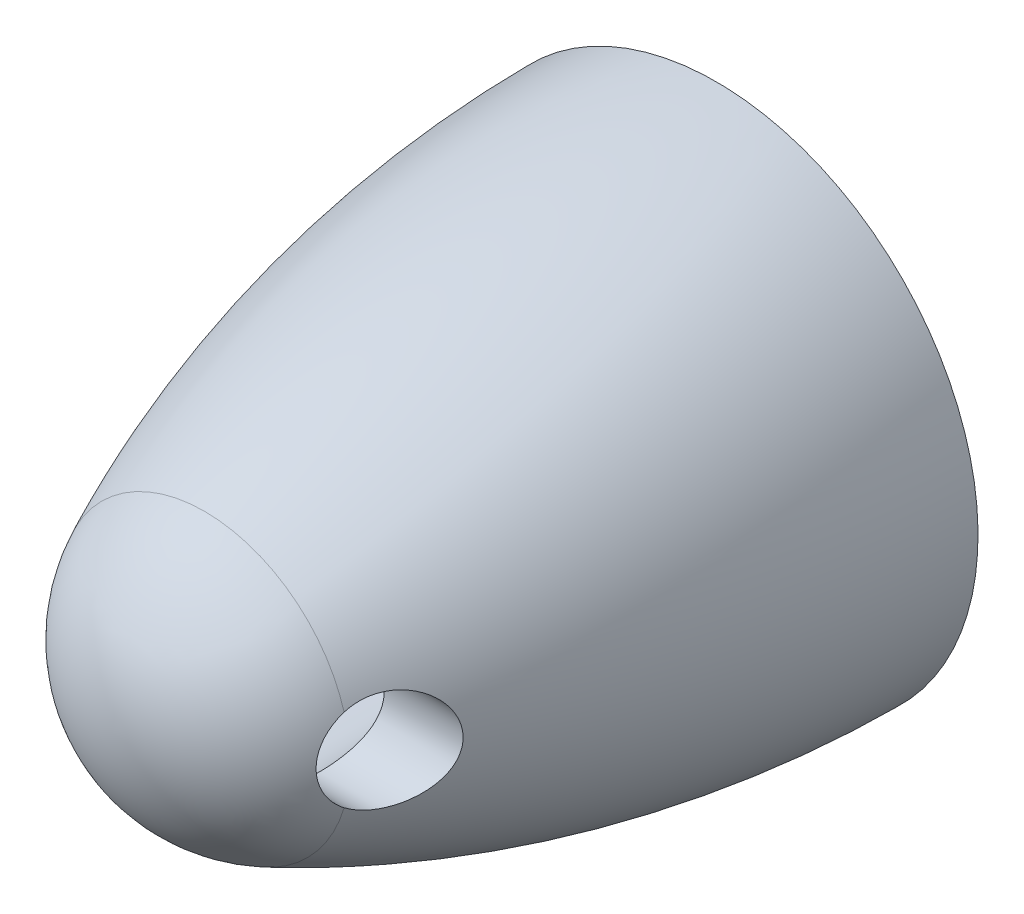
ISO-10303-21;
HEADER;
FILE_DESCRIPTION(('STEP AP214'),'2;1');
FILE_NAME('part.step','',(''),(''),'','','');
FILE_SCHEMA(('AUTOMOTIVE_DESIGN { 1 0 10303 214 1 1 1 1 }'));
ENDSEC;
DATA;
#1=APPLICATION_CONTEXT('core data for automotive mechanical design processes');
#2=APPLICATION_PROTOCOL_DEFINITION('international standard','automotive_design',2000,#1);
#3=PRODUCT_CONTEXT('',#1,'mechanical');
#4=PRODUCT('Part','Part','',(#3));
#5=PRODUCT_RELATED_PRODUCT_CATEGORY('part','',(#4));
#6=PRODUCT_DEFINITION_FORMATION('','',#4);
#7=PRODUCT_DEFINITION_CONTEXT('part definition',#1,'design');
#8=PRODUCT_DEFINITION('design','',#6,#7);
#9=PRODUCT_DEFINITION_SHAPE('','',#8);
#10=(LENGTH_UNIT() NAMED_UNIT(*) SI_UNIT(.MILLI.,.METRE.));
#11=(NAMED_UNIT(*) PLANE_ANGLE_UNIT() SI_UNIT($,.RADIAN.));
#12=(NAMED_UNIT(*) SI_UNIT($,.STERADIAN.) SOLID_ANGLE_UNIT());
#13=UNCERTAINTY_MEASURE_WITH_UNIT(LENGTH_MEASURE(1.E-05),#10,'distance_accuracy_value','');
#14=(GEOMETRIC_REPRESENTATION_CONTEXT(3) GLOBAL_UNCERTAINTY_ASSIGNED_CONTEXT((#13)) GLOBAL_UNIT_ASSIGNED_CONTEXT((#10,
#11,#12)) REPRESENTATION_CONTEXT('',''));
#15=CARTESIAN_POINT('',(0.,0.,0.));
#16=DIRECTION('',(0.,0.,1.));
#17=DIRECTION('',(1.,0.,0.));
#18=AXIS2_PLACEMENT_3D('',#15,#16,#17);
#19=CARTESIAN_POINT('',(0.,0.,-0.124297730643496));
#20=DIRECTION('',(0.,0.,-1.));
#21=DIRECTION('',(-1.,0.,0.));
#22=AXIS2_PLACEMENT_3D('',#19,#20,#21);
#23=DEGENERATE_TOROIDAL_SURFACE('',#22,23.5,30.,.F.);
#24=CARTESIAN_POINT('',(3.46615625761982,-1.02765857423062,12.711630420099));
#25=CARTESIAN_POINT('',(3.47465651878689,-1.04807601790001,12.6821488078625));
#26=CARTESIAN_POINT('',(3.48374766010701,-1.06712862057592,12.6519200785689));
#27=CARTESIAN_POINT('',(3.50309052405663,-1.10243743812266,12.5902486369812));
#28=CARTESIAN_POINT('',(3.51334161047095,-1.11869517373248,12.5588065963497));
#29=CARTESIAN_POINT('',(3.54569363617164,-1.16303698172731,12.4633973358953));
#30=CARTESIAN_POINT('',(3.56949134532311,-1.18692508612594,12.3980025103404));
#31=CARTESIAN_POINT('',(3.62091844613364,-1.22333503982868,12.2658092840912));
#32=CARTESIAN_POINT('',(3.64854074952291,-1.23587759957957,12.1990136695126));
#33=CARTESIAN_POINT('',(3.70681105154354,-1.2500872990971,12.0655208834277));
#34=CARTESIAN_POINT('',(3.73746269455597,-1.2517411737642,11.9988239309236));
#35=CARTESIAN_POINT('',(3.80351490544663,-1.24434703905072,11.861259635281));
#36=CARTESIAN_POINT('',(3.83909689606422,-1.23436062493811,11.7905308092886));
#37=CARTESIAN_POINT('',(3.9113272630148,-1.20275326419728,11.6522655507179));
#38=CARTESIAN_POINT('',(3.94797629708653,-1.1811249913421,11.5847311575426));
#39=CARTESIAN_POINT('',(4.02469297780867,-1.12397496211952,11.4475056703041));
#40=CARTESIAN_POINT('',(4.06473135870797,-1.08726895060851,11.3782876521898));
#41=CARTESIAN_POINT('',(4.14255243030917,-1.00086921026723,11.2470563802899));
#42=CARTESIAN_POINT('',(4.18033646123778,-0.951183294521051,11.185038824608));
#43=CARTESIAN_POINT('',(4.24541493725388,-0.849001575646202,11.0801635999997));
#44=CARTESIAN_POINT('',(4.2733974843864,-0.798445406406109,11.0358437013666));
#45=CARTESIAN_POINT('',(4.3249783972579,-0.689377513593669,10.9550811469388));
#46=CARTESIAN_POINT('',(4.34857873682077,-0.630869392389148,10.9186349434773));
#47=CARTESIAN_POINT('',(4.39008150812592,-0.506448993258439,10.8550436216105));
#48=CARTESIAN_POINT('',(4.40793765899972,-0.440482093425154,10.8279739220414));
#49=CARTESIAN_POINT('',(4.43622417721521,-0.303444308141968,10.785276500215));
#50=CARTESIAN_POINT('',(4.44666273854468,-0.232379150464057,10.7696361517536));
#51=CARTESIAN_POINT('',(4.45826446233044,-0.0979961087418942,10.7522692358374));
#52=CARTESIAN_POINT('',(4.46051811805218,-0.034979879450924,10.7489064930713));
#53=CARTESIAN_POINT('',(4.45863837968193,0.0907322715302227,10.7517152493736));
#54=CARTESIAN_POINT('',(4.45450726011885,0.153428299307684,10.7578833531483));
#55=CARTESIAN_POINT('',(4.44066289902417,0.272361000949817,10.7786394180797));
#56=CARTESIAN_POINT('',(4.43134131323984,0.328749289766289,10.7926369029275));
#57=CARTESIAN_POINT('',(4.40799520467772,0.438161470441607,10.8278993157812));
#58=CARTESIAN_POINT('',(4.39396992501944,0.491184819207408,10.849165413404));
#59=CARTESIAN_POINT('',(4.36090123082357,0.596210336186879,10.8997047325471));
#60=CARTESIAN_POINT('',(4.3415891222775,0.647917687200737,10.9294114762099));
#61=CARTESIAN_POINT('',(4.29940749033492,0.745627075753359,10.9950083643971));
#62=CARTESIAN_POINT('',(4.27653625785515,0.791626353113697,11.0309014804989));
#63=CARTESIAN_POINT('',(4.22458265077447,0.883776734141518,11.1135403400333));
#64=CARTESIAN_POINT('',(4.19508148119489,0.928955677666932,11.1611058160657));
#65=CARTESIAN_POINT('',(4.13383378409108,1.01081247199557,11.2617767082244));
#66=CARTESIAN_POINT('',(4.10208589385355,1.04748510474333,11.3148854959955));
#67=CARTESIAN_POINT('',(4.03247294041364,1.11701881046211,11.434107009109));
#68=CARTESIAN_POINT('',(3.99441880900892,1.1484229957194,11.5009627730063));
#69=CARTESIAN_POINT('',(3.91835692344024,1.19906331819373,11.6392070048179));
#70=CARTESIAN_POINT('',(3.88034922027089,1.21829093660621,11.7105986076977));
#71=CARTESIAN_POINT('',(3.80327227845025,1.2448409938488,11.8616070159147));
#72=CARTESIAN_POINT('',(3.76431611160357,1.25123195075573,11.9414492883429));
#73=CARTESIAN_POINT('',(3.69002998848706,1.24838053525451,12.1025670852601));
#74=CARTESIAN_POINT('',(3.65469779248747,1.23914788124002,12.1838416876773));
#75=CARTESIAN_POINT('',(3.5953476307428,1.207483336925,12.3301828209219));
#76=CARTESIAN_POINT('',(3.57044323891807,1.18778459777512,12.3954866641329));
#77=CARTESIAN_POINT('',(3.52491624039993,1.13732912918625,12.5231244075804));
#78=CARTESIAN_POINT('',(3.5042820068257,1.10660306680085,12.5854660066867));
#79=CARTESIAN_POINT('',(3.47900904484297,1.05702781846493,12.6677528802878));
#80=CARTESIAN_POINT('',(3.47241621892549,1.04271142203358,12.6899059204764));
#81=CARTESIAN_POINT('',(3.46615625761982,1.02765857423064,12.711630420099));
#82=B_SPLINE_CURVE_WITH_KNOTS('',3,(#24,#25,#26,#27,#28,#29,#30,#31,#32,#33,#34,#35,#36,#37,#38,
#39,#40,#41,#42,#43,#44,#45,#46,#47,#48,#49,#50,#51,#52,#53,#54,#55,#56,#57,#58,#59,#60,#61,#62,
#63,#64,#65,#66,#67,#68,#69,#70,#71,#72,#73,#74,#75,#76,#77,#78,#79,#80,#81),.UNSPECIFIED.,.F.,
.F.,(4,2,2,2,2,2,2,2,2,2,2,2,2,2,2,2,2,2,2,2,2,2,2,2,2,2,2,2,4),(0.,0.110486533528863,
0.220912757686076,0.440497174869241,0.659679943384847,0.879129681151121,1.11756815341486,
1.35615685084225,1.61888418770536,1.88145374221404,2.09904073576579,2.31652948528037,
2.53572903280445,2.75468605916668,2.94310848524276,3.13146380269543,3.30722666936411,
3.48301783195744,3.67033316264982,3.85773872089173,4.07269962562468,4.28779204787302,
4.53601125669036,4.78440392997816,5.05025050034675,5.31593176628929,5.5328572035393,
5.74918398596229,5.83068670753945),.UNSPECIFIED.);
#83=CARTESIAN_POINT('',(3.46621395182149,-1.02779704093647,12.711430420099));
#84=VERTEX_POINT('',#83);
#85=CARTESIAN_POINT('',(3.4662139518215,1.02779704093647,12.711430420099));
#86=VERTEX_POINT('',#85);
#87=EDGE_CURVE('E60',#84,#86,#82,.T.);
#88=ORIENTED_EDGE('',*,*,#87,.F.);
#89=CARTESIAN_POINT('',(0.,0.,12.711430420099));
#90=DIRECTION('',(0.,0.,-1.));
#91=DIRECTION('',(-1.,0.,0.));
#92=AXIS2_PLACEMENT_3D('',#89,#90,#91);
#93=CIRCLE('',#92,3.61538461538462);
#94=CARTESIAN_POINT('',(-3.4662139518215,-1.02779704093647,12.711430420099));
#95=VERTEX_POINT('',#94);
#96=EDGE_CURVE('E109',#84,#95,#93,.T.);
#97=ORIENTED_EDGE('',*,*,#96,.T.);
#98=CARTESIAN_POINT('',(-3.46615625761982,1.02765857423062,12.711630420099));
#99=CARTESIAN_POINT('',(-3.47465651878689,1.04807601790001,12.6821488078625));
#100=CARTESIAN_POINT('',(-3.48374766010701,1.06712862057592,12.6519200785689));
#101=CARTESIAN_POINT('',(-3.50309052405663,1.10243743812266,12.5902486369812));
#102=CARTESIAN_POINT('',(-3.51334161047095,1.11869517373248,12.5588065963497));
#103=CARTESIAN_POINT('',(-3.54569363617164,1.16303698172731,12.4633973358953));
#104=CARTESIAN_POINT('',(-3.56949134532311,1.18692508612594,12.3980025103404));
#105=CARTESIAN_POINT('',(-3.62091844613364,1.22333503982868,12.2658092840912));
#106=CARTESIAN_POINT('',(-3.64854074952291,1.23587759957957,12.1990136695126));
#107=CARTESIAN_POINT('',(-3.70681105154354,1.2500872990971,12.0655208834277));
#108=CARTESIAN_POINT('',(-3.73746269455597,1.2517411737642,11.9988239309236));
#109=CARTESIAN_POINT('',(-3.80351490544663,1.24434703905072,11.861259635281));
#110=CARTESIAN_POINT('',(-3.83909689606422,1.23436062493811,11.7905308092886));
#111=CARTESIAN_POINT('',(-3.9113272630148,1.20275326419728,11.6522655507179));
#112=CARTESIAN_POINT('',(-3.94797629708653,1.1811249913421,11.5847311575426));
#113=CARTESIAN_POINT('',(-4.02469297780867,1.12397496211952,11.4475056703041));
#114=CARTESIAN_POINT('',(-4.06473135870797,1.08726895060851,11.3782876521898));
#115=CARTESIAN_POINT('',(-4.14255243030917,1.00086921026723,11.2470563802899));
#116=CARTESIAN_POINT('',(-4.18033646123778,0.951183294521051,11.185038824608));
#117=CARTESIAN_POINT('',(-4.24541493725388,0.849001575646202,11.0801635999997));
#118=CARTESIAN_POINT('',(-4.2733974843864,0.798445406406109,11.0358437013666));
#119=CARTESIAN_POINT('',(-4.3249783972579,0.689377513593669,10.9550811469388));
#120=CARTESIAN_POINT('',(-4.34857873682077,0.630869392389148,10.9186349434773));
#121=CARTESIAN_POINT('',(-4.39008150812592,0.506448993258439,10.8550436216105));
#122=CARTESIAN_POINT('',(-4.40793765899972,0.440482093425154,10.8279739220414));
#123=CARTESIAN_POINT('',(-4.43622417721521,0.303444308141968,10.785276500215));
#124=CARTESIAN_POINT('',(-4.44666273854468,0.232379150464057,10.7696361517536));
#125=CARTESIAN_POINT('',(-4.45826446233044,0.0979961087418942,10.7522692358374));
#126=CARTESIAN_POINT('',(-4.46051811805218,0.034979879450924,10.7489064930713));
#127=CARTESIAN_POINT('',(-4.45863837968193,-0.0907322715302227,10.7517152493736));
#128=CARTESIAN_POINT('',(-4.45450726011885,-0.153428299307684,10.7578833531483));
#129=CARTESIAN_POINT('',(-4.44066289902417,-0.272361000949817,10.7786394180797));
#130=CARTESIAN_POINT('',(-4.43134131323984,-0.328749289766289,10.7926369029275));
#131=CARTESIAN_POINT('',(-4.40799520467772,-0.438161470441607,10.8278993157812));
#132=CARTESIAN_POINT('',(-4.39396992501944,-0.491184819207408,10.849165413404));
#133=CARTESIAN_POINT('',(-4.36090123082357,-0.596210336186879,10.8997047325471));
#134=CARTESIAN_POINT('',(-4.3415891222775,-0.647917687200737,10.9294114762099));
#135=CARTESIAN_POINT('',(-4.29940749033492,-0.745627075753359,10.9950083643971));
#136=CARTESIAN_POINT('',(-4.27653625785515,-0.791626353113697,11.0309014804989));
#137=CARTESIAN_POINT('',(-4.22458265077447,-0.883776734141518,11.1135403400333));
#138=CARTESIAN_POINT('',(-4.19508148119489,-0.928955677666932,11.1611058160657));
#139=CARTESIAN_POINT('',(-4.13383378409108,-1.01081247199557,11.2617767082244));
#140=CARTESIAN_POINT('',(-4.10208589385355,-1.04748510474333,11.3148854959955));
#141=CARTESIAN_POINT('',(-4.03247294041364,-1.11701881046211,11.434107009109));
#142=CARTESIAN_POINT('',(-3.99441880900892,-1.1484229957194,11.5009627730063));
#143=CARTESIAN_POINT('',(-3.91835692344024,-1.19906331819373,11.6392070048179));
#144=CARTESIAN_POINT('',(-3.88034922027089,-1.21829093660621,11.7105986076977));
#145=CARTESIAN_POINT('',(-3.80327227845025,-1.2448409938488,11.8616070159147));
#146=CARTESIAN_POINT('',(-3.76431611160357,-1.25123195075573,11.9414492883429));
#147=CARTESIAN_POINT('',(-3.69002998848706,-1.24838053525451,12.1025670852601));
#148=CARTESIAN_POINT('',(-3.65469779248747,-1.23914788124002,12.1838416876773));
#149=CARTESIAN_POINT('',(-3.5953476307428,-1.207483336925,12.3301828209219));
#150=CARTESIAN_POINT('',(-3.57044323891807,-1.18778459777512,12.3954866641329));
#151=CARTESIAN_POINT('',(-3.52491624039993,-1.13732912918625,12.5231244075804));
#152=CARTESIAN_POINT('',(-3.5042820068257,-1.10660306680085,12.5854660066867));
#153=CARTESIAN_POINT('',(-3.47900904484297,-1.05702781846493,12.6677528802878));
#154=CARTESIAN_POINT('',(-3.47241621892549,-1.04271142203358,12.6899059204764));
#155=CARTESIAN_POINT('',(-3.46615625761982,-1.02765857423064,12.711630420099));
#156=B_SPLINE_CURVE_WITH_KNOTS('',3,(#98,#99,#100,#101,#102,#103,#104,#105,#106,#107,#108,#109,
#110,#111,#112,#113,#114,#115,#116,#117,#118,#119,#120,#121,#122,#123,#124,#125,#126,#127,#128,
#129,#130,#131,#132,#133,#134,#135,#136,#137,#138,#139,#140,#141,#142,#143,#144,#145,#146,#147,
#148,#149,#150,#151,#152,#153,#154,#155),.UNSPECIFIED.,.F.,.F.,(4,2,2,2,2,2,2,2,2,2,2,2,2,2,2,2,
2,2,2,2,2,2,2,2,2,2,2,2,4),(0.,0.110486533528863,0.220912757686076,0.440497174869241,
0.659679943384847,0.879129681151121,1.11756815341486,1.35615685084225,1.61888418770536,
1.88145374221404,2.09904073576579,2.31652948528037,2.53572903280445,2.75468605916668,
2.94310848524276,3.13146380269543,3.30722666936411,3.48301783195744,3.67033316264982,
3.85773872089173,4.07269962562468,4.28779204787302,4.53601125669036,4.78440392997816,
5.05025050034675,5.31593176628929,5.5328572035393,5.74918398596229,5.83068670753945),.UNSPECIFIED.);
#157=CARTESIAN_POINT('',(-3.46621395182149,1.02779704093647,12.711430420099));
#158=VERTEX_POINT('',#157);
#159=EDGE_CURVE('E53',#158,#95,#156,.T.);
#160=ORIENTED_EDGE('',*,*,#159,.F.);
#161=EDGE_CURVE('E89',#158,#86,#93,.T.);
#162=ORIENTED_EDGE('',*,*,#161,.T.);
#163=EDGE_LOOP('',(#88,#97,#160,#162));
#164=FACE_BOUND('',#163,.T.);
#165=CARTESIAN_POINT('',(0.,0.,0.));
#166=DIRECTION('',(0.,0.,-1.));
#167=DIRECTION('',(-1.,0.,0.));
#168=AXIS2_PLACEMENT_3D('',#165,#166,#167);
#169=CIRCLE('',#168,6.49974250013085);
#170=CARTESIAN_POINT('',(-6.49974250013085,0.,0.));
#171=VERTEX_POINT('',#170);
#172=EDGE_CURVE('E102',#171,#171,#169,.T.);
#173=ORIENTED_EDGE('',*,*,#172,.F.);
#174=EDGE_LOOP('',(#173));
#175=FACE_BOUND('',#174,.T.);
#176=ADVANCED_FACE('F34',(#164,#175),#23,.F.);
#177=CARTESIAN_POINT('',(0.,0.,11.));
#178=DIRECTION('',(0.,0.,-1.));
#179=DIRECTION('',(0.,1.,0.));
#180=AXIS2_PLACEMENT_3D('',#177,#178,#179);
#181=SPHERICAL_SURFACE('',#180,4.);
#182=CARTESIAN_POINT('',(3.46627165118402,1.02793545007738,12.711230420099));
#183=CARTESIAN_POINT('',(3.45803902218797,1.00818969012669,12.7397674543915));
#184=CARTESIAN_POINT('',(3.45000627031838,0.987237789776852,12.7675088994648));
#185=CARTESIAN_POINT('',(3.43439958141427,0.94302341904918,12.8212301181988));
#186=CARTESIAN_POINT('',(3.42682571528331,0.919760593062849,12.8472096196909));
#187=CARTESIAN_POINT('',(3.40488372223414,0.84666448856219,12.9222401803932));
#188=CARTESIAN_POINT('',(3.39129642293037,0.793526503439699,12.9683790690547));
#189=CARTESIAN_POINT('',(3.36674042592054,0.679793768546704,13.0513554191213));
#190=CARTESIAN_POINT('',(3.35577557736714,0.61918825332215,13.0881792126297));
#191=CARTESIAN_POINT('',(3.33695310855825,0.492266162903189,13.151166471323));
#192=CARTESIAN_POINT('',(3.32909284973387,0.4259544959628,13.1773389895286));
#193=CARTESIAN_POINT('',(3.31701014120736,0.291540725185956,13.2174897710237));
#194=CARTESIAN_POINT('',(3.31268850861892,0.223546838764541,13.2318006528038));
#195=CARTESIAN_POINT('',(3.3075034118584,0.0859791264112251,13.2489640834034));
#196=CARTESIAN_POINT('',(3.30664048027637,0.0164050588128973,13.2518148675334));
#197=CARTESIAN_POINT('',(3.30839142175228,-0.120363810146961,13.2460233692186));
#198=CARTESIAN_POINT('',(3.31091387649477,-0.187572845927709,13.2376832841001));
#199=CARTESIAN_POINT('',(3.3191621851794,-0.31956037109663,13.2103395713086));
#200=CARTESIAN_POINT('',(3.32488723856617,-0.384339463582685,13.1913386085377));
#201=CARTESIAN_POINT('',(3.33931426353958,-0.509876099118331,13.1432659757738));
#202=CARTESIAN_POINT('',(3.34802396904084,-0.570622699970703,13.1141681399869));
#203=CARTESIAN_POINT('',(3.36807377260888,-0.686375856511214,13.0468396411053));
#204=CARTESIAN_POINT('',(3.37941492014439,-0.741380109318647,13.0086053340311));
#205=CARTESIAN_POINT('',(3.40277421136701,-0.837957448710605,12.9293729587975));
#206=CARTESIAN_POINT('',(3.4145380668557,-0.88035042416542,12.88929130541));
#207=CARTESIAN_POINT('',(3.43944415766713,-0.958933579989559,12.8039406092823));
#208=CARTESIAN_POINT('',(3.45258428920337,-0.995133011057766,12.7586794744089));
#209=CARTESIAN_POINT('',(3.46627165118402,-1.02793545007738,12.711230420099));
#210=B_SPLINE_CURVE_WITH_KNOTS('',3,(#182,#183,#184,#185,#186,#187,#188,#189,#190,#191,#192,
#193,#194,#195,#196,#197,#198,#199,#200,#201,#202,#203,#204,#205,#206,#207,#208,#209),
.UNSPECIFIED.,.F.,.F.,(4,2,2,2,2,2,2,2,2,2,2,2,2,4),(0.,0.106935836816099,0.213888154635262,
0.427808437343622,0.642040804790455,0.856090703844912,1.06391317855968,1.27176765370786,
1.47412071043617,1.67642320744738,1.87925393074501,2.08216568623032,2.26015223816337,
2.4378705830193),.UNSPECIFIED.);
#211=EDGE_CURVE('E143',#86,#84,#210,.T.);
#212=ORIENTED_EDGE('',*,*,#211,.F.);
#213=ORIENTED_EDGE('',*,*,#161,.F.);
#214=CARTESIAN_POINT('',(-3.46627165118402,-1.02793545007738,12.711230420099));
#215=CARTESIAN_POINT('',(-3.45803902218797,-1.00818969012669,12.7397674543915));
#216=CARTESIAN_POINT('',(-3.45000627031839,-0.987237789776852,12.7675088994648));
#217=CARTESIAN_POINT('',(-3.43439958141427,-0.94302341904918,12.8212301181988));
#218=CARTESIAN_POINT('',(-3.42682571528331,-0.919760593062849,12.8472096196909));
#219=CARTESIAN_POINT('',(-3.40488372223413,-0.846664488562191,12.9222401803932));
#220=CARTESIAN_POINT('',(-3.39129642293037,-0.793526503439699,12.9683790690547));
#221=CARTESIAN_POINT('',(-3.36674042592054,-0.679793768546704,13.0513554191213));
#222=CARTESIAN_POINT('',(-3.35577557736714,-0.61918825332215,13.0881792126297));
#223=CARTESIAN_POINT('',(-3.33695310855826,-0.492266162903189,13.151166471323));
#224=CARTESIAN_POINT('',(-3.32909284973387,-0.425954495962799,13.1773389895286));
#225=CARTESIAN_POINT('',(-3.31701014120736,-0.291540725185956,13.2174897710237));
#226=CARTESIAN_POINT('',(-3.31268850861892,-0.223546838764541,13.2318006528038));
#227=CARTESIAN_POINT('',(-3.3075034118584,-0.085979126411225,13.2489640834034));
#228=CARTESIAN_POINT('',(-3.30664048027637,-0.016405058812897,13.2518148675334));
#229=CARTESIAN_POINT('',(-3.30839142175228,0.120363810146962,13.2460233692186));
#230=CARTESIAN_POINT('',(-3.31091387649477,0.18757284592771,13.2376832841001));
#231=CARTESIAN_POINT('',(-3.3191621851794,0.31956037109663,13.2103395713086));
#232=CARTESIAN_POINT('',(-3.32488723856617,0.384339463582685,13.1913386085377));
#233=CARTESIAN_POINT('',(-3.33931426353958,0.509876099118331,13.1432659757738));
#234=CARTESIAN_POINT('',(-3.34802396904084,0.570622699970703,13.1141681399869));
#235=CARTESIAN_POINT('',(-3.36807377260888,0.686375856511215,13.0468396411053));
#236=CARTESIAN_POINT('',(-3.37941492014439,0.741380109318647,13.0086053340311));
#237=CARTESIAN_POINT('',(-3.40277421136701,0.837957448710606,12.9293729587975));
#238=CARTESIAN_POINT('',(-3.4145380668557,0.880350424165421,12.88929130541));
#239=CARTESIAN_POINT('',(-3.43944415766713,0.95893357998956,12.8039406092823));
#240=CARTESIAN_POINT('',(-3.45258428920337,0.995133011057767,12.7586794744089));
#241=CARTESIAN_POINT('',(-3.46627165118402,1.02793545007738,12.711230420099));
#242=B_SPLINE_CURVE_WITH_KNOTS('',3,(#214,#215,#216,#217,#218,#219,#220,#221,#222,#223,#224,
#225,#226,#227,#228,#229,#230,#231,#232,#233,#234,#235,#236,#237,#238,#239,#240,#241),
.UNSPECIFIED.,.F.,.F.,(4,2,2,2,2,2,2,2,2,2,2,2,2,4),(0.,0.106935836816099,0.213888154635263,
0.427808437343622,0.642040804790455,0.856090703844912,1.06391317855968,1.27176765370786,
1.47412071043617,1.67642320744738,1.87925393074501,2.08216568623032,2.26015223816338,
2.43787058301929),.UNSPECIFIED.);
#243=EDGE_CURVE('E134',#95,#158,#242,.T.);
#244=ORIENTED_EDGE('',*,*,#243,.F.);
#245=ORIENTED_EDGE('',*,*,#96,.F.);
#246=EDGE_LOOP('',(#212,#213,#244,#245));
#247=FACE_BOUND('',#246,.T.);
#248=ADVANCED_FACE('F150',(#247),#181,.T.);
#249=CARTESIAN_POINT('',(0.,1.48879112486373,0.));
#250=DIRECTION('',(0.,0.,-1.));
#251=DIRECTION('',(-1.,0.,0.));
#252=AXIS2_PLACEMENT_3D('',#249,#250,#251);
#253=PLANE('',#252);
#254=CARTESIAN_POINT('',(0.,0.,0.));
#255=DIRECTION('',(0.,0.,-1.));
#256=DIRECTION('',(-1.,0.,0.));
#257=AXIS2_PLACEMENT_3D('',#254,#255,#256);
#258=CIRCLE('',#257,2.5);
#259=CARTESIAN_POINT('',(-2.5,0.,0.));
#260=VERTEX_POINT('',#259);
#261=EDGE_CURVE('E100',#260,#260,#258,.T.);
#262=ORIENTED_EDGE('',*,*,#261,.F.);
#263=EDGE_LOOP('',(#262));
#264=FACE_BOUND('',#263,.T.);
#265=ORIENTED_EDGE('',*,*,#172,.T.);
#266=EDGE_LOOP('',(#265));
#267=FACE_BOUND('',#266,.T.);
#268=ADVANCED_FACE('F154',(#264,#267),#253,.T.);
#269=CARTESIAN_POINT('',(0.,0.,12.99972));
#270=DIRECTION('',(0.,0.,-1.));
#271=DIRECTION('',(-1.,0.,0.));
#272=AXIS2_PLACEMENT_3D('',#269,#270,#271);
#273=CONICAL_SURFACE('',#272,2.5,1.02974425867665);
#274=CARTESIAN_POINT('',(0.,0.,14.5018715475689));
#275=VERTEX_POINT('',#274);
#276=VERTEX_LOOP('',#275);
#277=FACE_BOUND('',#276,.T.);
#278=CARTESIAN_POINT('',(0.,0.,12.99972));
#279=DIRECTION('',(0.,0.,-1.));
#280=DIRECTION('',(-1.,0.,0.));
#281=AXIS2_PLACEMENT_3D('',#278,#279,#280);
#282=CIRCLE('',#281,2.5);
#283=CARTESIAN_POINT('',(-2.38473060918838,0.750373188220366,12.99972));
#284=VERTEX_POINT('',#283);
#285=CARTESIAN_POINT('',(2.38473060918838,0.750373188220366,12.99972));
#286=VERTEX_POINT('',#285);
#287=EDGE_CURVE('E95',#284,#286,#282,.T.);
#288=ORIENTED_EDGE('',*,*,#287,.T.);
#289=CARTESIAN_POINT('',(2.41843538953355,0.782857165731378,12.9744919999995));
#290=CARTESIAN_POINT('',(2.38015192084589,0.747555570339361,13.0028570709257));
#291=CARTESIAN_POINT('',(2.34391136425703,0.709117786915568,13.0305663603079));
#292=CARTESIAN_POINT('',(2.27670366683037,0.625604102943495,13.0833205140522));
#293=CARTESIAN_POINT('',(2.24578659036323,0.580471906040079,13.108339331257));
#294=CARTESIAN_POINT('',(2.19093486669189,0.483450332028471,13.1539757337496));
#295=CARTESIAN_POINT('',(2.16705774268094,0.431510040259106,13.1745567102081));
#296=CARTESIAN_POINT('',(2.12797602481898,0.322607220560018,13.208992595813));
#297=CARTESIAN_POINT('',(2.11273447644694,0.265667315888708,13.2228761270467));
#298=CARTESIAN_POINT('',(2.09280599735473,0.156551449354937,13.241224424861));
#299=CARTESIAN_POINT('',(2.08698504606792,0.104748876163918,13.2466961817109));
#300=CARTESIAN_POINT('',(2.08230352072519,0.000494369861177152,13.2510876068438));
#301=CARTESIAN_POINT('',(2.08344895974321,-0.0519580852224945,13.2500016147795));
#302=CARTESIAN_POINT('',(2.09234839200907,-0.15178049140755,13.241685608966));
#303=CARTESIAN_POINT('',(2.09959933832403,-0.199236188901494,13.2349234006281));
#304=CARTESIAN_POINT('',(2.11990176757202,-0.29180933703555,13.216377130583));
#305=CARTESIAN_POINT('',(2.13294751744033,-0.336929049631821,13.2045980327872));
#306=CARTESIAN_POINT('',(2.16481408659789,-0.424740395339414,13.1765488957321));
#307=CARTESIAN_POINT('',(2.18375087863221,-0.467360768846897,13.1601893976775));
#308=CARTESIAN_POINT('',(2.22668325670814,-0.548502596668387,13.1241095402355));
#309=CARTESIAN_POINT('',(2.25068815386725,-0.587016307471462,13.1043830078928));
#310=CARTESIAN_POINT('',(2.29799109356211,-0.652821490846483,13.0665297686023));
#311=CARTESIAN_POINT('',(2.32057907161374,-0.680863648116198,13.0487956810759));
#312=CARTESIAN_POINT('',(2.36795409640419,-0.733994705629502,13.0123146764847));
#313=CARTESIAN_POINT('',(2.39272934348976,-0.759097934692559,12.9935733845859));
#314=CARTESIAN_POINT('',(2.41843538953355,-0.782857165731377,12.9744919999995));
#315=B_SPLINE_CURVE_WITH_KNOTS('',3,(#289,#290,#291,#292,#293,#294,#295,#296,#297,#298,#299,
#300,#301,#302,#303,#304,#305,#306,#307,#308,#309,#310,#311,#312,#313,#314),.UNSPECIFIED.,.F.,
.F.,(4,2,2,2,2,2,2,2,2,2,2,2,4),(0.,0.178142256052216,0.357877812589265,0.539043681841487,
0.719428309803198,0.875825551385949,1.03235780716231,1.17712792920599,1.32175514144313,
1.46943196376067,1.61738249617088,1.73761590187897,1.8572362711508),.UNSPECIFIED.);
#316=CARTESIAN_POINT('',(2.38473060918838,-0.750373188220366,12.99972));
#317=VERTEX_POINT('',#316);
#318=EDGE_CURVE('E84',#286,#317,#315,.T.);
#319=ORIENTED_EDGE('',*,*,#318,.T.);
#320=CARTESIAN_POINT('',(-2.38473060918838,-0.750373188220366,12.99972));
#321=VERTEX_POINT('',#320);
#322=EDGE_CURVE('E94',#317,#321,#282,.T.);
#323=ORIENTED_EDGE('',*,*,#322,.T.);
#324=CARTESIAN_POINT('',(-2.41843538953356,-0.782857165731383,12.9744919999995));
#325=CARTESIAN_POINT('',(-2.3801519208459,-0.747555570339366,13.0028570709257));
#326=CARTESIAN_POINT('',(-2.34391136425703,-0.709117786915574,13.0305663603079));
#327=CARTESIAN_POINT('',(-2.27670366683038,-0.625604102943501,13.0833205140522));
#328=CARTESIAN_POINT('',(-2.24578659036323,-0.580471906040084,13.108339331257));
#329=CARTESIAN_POINT('',(-2.19093486669189,-0.483450332028476,13.1539757337496));
#330=CARTESIAN_POINT('',(-2.16705774268095,-0.431510040259111,13.1745567102081));
#331=CARTESIAN_POINT('',(-2.12797602481898,-0.322607220560024,13.208992595813));
#332=CARTESIAN_POINT('',(-2.11273447644694,-0.265667315888713,13.2228761270467));
#333=CARTESIAN_POINT('',(-2.09280599735473,-0.156551449354942,13.241224424861));
#334=CARTESIAN_POINT('',(-2.08698504606792,-0.104748876163923,13.2466961817109));
#335=CARTESIAN_POINT('',(-2.08230352072519,-0.00049436986118134,13.2510876068438));
#336=CARTESIAN_POINT('',(-2.08344895974321,0.0519580852224906,13.2500016147795));
#337=CARTESIAN_POINT('',(-2.09234839200907,0.151780491407546,13.241685608966));
#338=CARTESIAN_POINT('',(-2.09959933832402,0.19923618890149,13.2349234006281));
#339=CARTESIAN_POINT('',(-2.11990176757202,0.291809337035547,13.216377130583));
#340=CARTESIAN_POINT('',(-2.13294751744033,0.336929049631817,13.2045980327872));
#341=CARTESIAN_POINT('',(-2.16481408659789,0.424740395339411,13.1765488957321));
#342=CARTESIAN_POINT('',(-2.18375087863221,0.467360768846894,13.1601893976775));
#343=CARTESIAN_POINT('',(-2.22668325670814,0.548502596668384,13.1241095402355));
#344=CARTESIAN_POINT('',(-2.25068815386724,0.587016307471459,13.1043830078928));
#345=CARTESIAN_POINT('',(-2.29799109356211,0.652821490846482,13.0665297686023));
#346=CARTESIAN_POINT('',(-2.32057907161374,0.680863648116198,13.0487956810759));
#347=CARTESIAN_POINT('',(-2.36795409640419,0.733994705629505,13.0123146764847));
#348=CARTESIAN_POINT('',(-2.39272934348977,0.759097934692564,12.9935733845859));
#349=CARTESIAN_POINT('',(-2.41843538953356,0.782857165731383,12.9744919999995));
#350=B_SPLINE_CURVE_WITH_KNOTS('',3,(#324,#325,#326,#327,#328,#329,#330,#331,#332,#333,#334,
#335,#336,#337,#338,#339,#340,#341,#342,#343,#344,#345,#346,#347,#348,#349),.UNSPECIFIED.,.F.,
.F.,(4,2,2,2,2,2,2,2,2,2,2,2,4),(0.,0.178142256052217,0.357877812589267,0.539043681841489,
0.719428309803201,0.875825551385953,1.03235780716232,1.17712792920599,1.32175514144313,
1.46943196376068,1.61738249617089,1.73761590187898,1.85723627115081),.UNSPECIFIED.);
#351=EDGE_CURVE('E96',#321,#284,#350,.T.);
#352=ORIENTED_EDGE('',*,*,#351,.T.);
#353=EDGE_LOOP('',(#288,#319,#323,#352));
#354=FACE_BOUND('',#353,.T.);
#355=ADVANCED_FACE('F92',(#277,#354),#273,.F.);
#356=CARTESIAN_POINT('',(0.,0.,0.));
#357=DIRECTION('',(0.,0.,-1.));
#358=DIRECTION('',(-1.,0.,0.));
#359=AXIS2_PLACEMENT_3D('',#356,#357,#358);
#360=CYLINDRICAL_SURFACE('',#359,2.5);
#361=ORIENTED_EDGE('',*,*,#287,.F.);
#362=CARTESIAN_POINT('',(-2.38473060918838,0.750373188220366,12.99972));
#363=CARTESIAN_POINT('',(-2.36671947980009,0.807707561243689,12.9566793971231));
#364=CARTESIAN_POINT('',(-2.34761211099683,0.86111153135778,12.908889740286));
#365=CARTESIAN_POINT('',(-2.3092508794602,0.959225480273842,12.8046951875723));
#366=CARTESIAN_POINT('',(-2.28999674652239,1.00389454166548,12.7482518553174));
#367=CARTESIAN_POINT('',(-2.25356885281377,1.08321151222637,12.6279706278234));
#368=CARTESIAN_POINT('',(-2.23639777697201,1.11784656631648,12.5641233923411));
#369=CARTESIAN_POINT('',(-2.20651439252,1.17573827559777,12.4305969901433));
#370=CARTESIAN_POINT('',(-2.19379240529353,1.19901967381694,12.3609308963749));
#371=CARTESIAN_POINT('',(-2.17544835561827,1.23197516578848,12.2224108264594));
#372=CARTESIAN_POINT('',(-2.16941656230033,1.24243922935435,12.1538014204813));
#373=CARTESIAN_POINT('',(-2.16402033572561,1.25181910642711,12.0155365886187));
#374=CARTESIAN_POINT('',(-2.16465291956715,1.25074008648746,11.9458816446449));
#375=CARTESIAN_POINT('',(-2.17202179220197,1.23788518801393,11.8157885301248));
#376=CARTESIAN_POINT('',(-2.17807230360743,1.22731078220807,11.7551859889477));
#377=CARTESIAN_POINT('',(-2.19454137439648,1.19761181947589,11.6367429817181));
#378=CARTESIAN_POINT('',(-2.20496109166308,1.17848499598458,11.5789032523675));
#379=CARTESIAN_POINT('',(-2.22949615272163,1.13140456317794,11.4648452938663));
#380=CARTESIAN_POINT('',(-2.24374791435555,1.10311503871926,11.4087962382031));
#381=CARTESIAN_POINT('',(-2.27424228235581,1.03879172433596,11.3019266688262));
#382=CARTESIAN_POINT('',(-2.29048590414888,1.00275397734808,11.2511088464182));
#383=CARTESIAN_POINT('',(-2.32560608340461,0.918631791662155,11.1494106106778));
#384=CARTESIAN_POINT('',(-2.34455576833182,0.869600122770776,11.0993355172204));
#385=CARTESIAN_POINT('',(-2.38119642034424,0.763576613982765,11.0078534126824));
#386=CARTESIAN_POINT('',(-2.39888692315868,0.706581860745757,10.9664495879527));
#387=CARTESIAN_POINT('',(-2.43170325730445,0.58392260602266,10.8923819054853));
#388=CARTESIAN_POINT('',(-2.44673440208834,0.518046685928492,10.8600231557655));
#389=CARTESIAN_POINT('',(-2.47180561188032,0.38082157996776,10.8071596931925));
#390=CARTESIAN_POINT('',(-2.48184998805827,0.309477183541861,10.786644738613));
#391=CARTESIAN_POINT('',(-2.49508440349578,0.170279833086725,10.7598113843285));
#392=CARTESIAN_POINT('',(-2.49881094932674,0.102692350117586,10.7523794349133));
#393=CARTESIAN_POINT('',(-2.50070136643383,-0.032859624823808,10.748596076596));
#394=CARTESIAN_POINT('',(-2.49886733321884,-0.10082396514141,10.7522404935572));
#395=CARTESIAN_POINT('',(-2.49015860980245,-0.230295248245769,10.7697803584106));
#396=CARTESIAN_POINT('',(-2.48363722163621,-0.291925933726372,10.7829577061111));
#397=CARTESIAN_POINT('',(-2.46656425132721,-0.411995495087677,10.8181895217127));
#398=CARTESIAN_POINT('',(-2.45601211944981,-0.470433934349384,10.8402452005108));
#399=CARTESIAN_POINT('',(-2.43130428865837,-0.585096169584624,10.8935106640731));
#400=CARTESIAN_POINT('',(-2.41702143153314,-0.641138130536958,10.925051053362));
#401=CARTESIAN_POINT('',(-2.38631869933593,-0.74735875175368,10.9959885304212));
#402=CARTESIAN_POINT('',(-2.36989778431718,-0.79753453603381,11.0353894465311));
#403=CARTESIAN_POINT('',(-2.33461177863086,-0.895868591254311,11.1254733186892));
#404=CARTESIAN_POINT('',(-2.31566612357768,-0.943328494456866,11.1768890086213));
#405=CARTESIAN_POINT('',(-2.27879996293163,-1.0292032288545,11.287168738611));
#406=CARTESIAN_POINT('',(-2.2608800555188,-1.06761282210281,11.346037061798));
#407=CARTESIAN_POINT('',(-2.22759956604503,-1.13546516392462,11.4722468086328));
#408=CARTESIAN_POINT('',(-2.21234869698592,-1.16455257275356,11.5398105874123));
#409=CARTESIAN_POINT('',(-2.18751806130212,-1.21056268096975,11.6799153719503));
#410=CARTESIAN_POINT('',(-2.17793028597353,-1.22750256658909,11.7524491862189));
#411=CARTESIAN_POINT('',(-2.16675887492809,-1.24710404870601,11.8920436759751));
#412=CARTESIAN_POINT('',(-2.16442692361947,-1.25110241811104,11.9588567569453));
#413=CARTESIAN_POINT('',(-2.16600082864421,-1.2483766239379,12.092177747854));
#414=CARTESIAN_POINT('',(-2.16990482023785,-1.241655665771,12.1586857430588));
#415=CARTESIAN_POINT('',(-2.18277686396657,-1.21886561078136,12.283878080853));
#416=CARTESIAN_POINT('',(-2.19130727077494,-1.2036011848087,12.3427588193246));
#417=CARTESIAN_POINT('',(-2.21207918388067,-1.16498230071587,12.4571238437909));
#418=CARTESIAN_POINT('',(-2.22432296515945,-1.14162288198172,12.5126060225576));
#419=CARTESIAN_POINT('',(-2.25238502266106,-1.08527889022143,12.6235865332426));
#420=CARTESIAN_POINT('',(-2.26841528737129,-1.05165764533329,12.6787060526353));
#421=CARTESIAN_POINT('',(-2.30172532836767,-0.976596470747519,12.7828633934081));
#422=CARTESIAN_POINT('',(-2.31900426565611,-0.935161761429117,12.8319052393923));
#423=CARTESIAN_POINT('',(-2.34441257969974,-0.868488802481492,12.8995487270022));
#424=CARTESIAN_POINT('',(-2.35266211370556,-0.845926628914484,12.9207989100395));
#425=CARTESIAN_POINT('',(-2.36891557467876,-0.799279781767107,12.9615655270679));
#426=CARTESIAN_POINT('',(-2.37691991044211,-0.775197873078228,12.98108496258));
#427=CARTESIAN_POINT('',(-2.38473060918838,-0.750373188220366,12.99972));
#428=B_SPLINE_CURVE_WITH_KNOTS('',3,(#362,#363,#364,#365,#366,#367,#368,#369,#370,#371,#372,
#373,#374,#375,#376,#377,#378,#379,#380,#381,#382,#383,#384,#385,#386,#387,#388,#389,#390,#391,
#392,#393,#394,#395,#396,#397,#398,#399,#400,#401,#402,#403,#404,#405,#406,#407,#408,#409,#410,
#411,#412,#413,#414,#415,#416,#417,#418,#419,#420,#421,#422,#423,#424,#425,#426,#427),
.UNSPECIFIED.,.F.,.F.,(4,2,2,2,2,2,2,2,2,2,2,2,2,2,2,2,2,2,2,2,2,2,2,2,2,2,2,2,2,2,2,2,4),(0.,
0.221489728848595,0.443993367082585,0.666780818089433,0.889080554140469,1.09684966650268,
1.30452578765537,1.48913415864091,1.67379148363164,1.866177057701,2.05866111860372,
2.27549498682724,2.49240839372187,2.71593810462239,2.93927423125345,3.14246690851682,
3.34558302196797,3.53480827860005,3.72405935201633,3.92087353826911,4.11778381465724,
4.3343009708179,4.55094313207618,4.7750644189424,4.99886799158837,5.19866277554903,
5.39839782587615,5.58188975419208,5.76549432583836,5.96429681243865,6.16296694152764,
6.25911424045931,6.3550913957881),.UNSPECIFIED.);
#429=EDGE_CURVE('E11',#284,#321,#428,.T.);
#430=ORIENTED_EDGE('',*,*,#429,.T.);
#431=ORIENTED_EDGE('',*,*,#322,.F.);
#432=CARTESIAN_POINT('',(2.38473060918838,-0.750373188220366,12.99972));
#433=CARTESIAN_POINT('',(2.36671947980009,-0.807707561243689,12.9566793971231));
#434=CARTESIAN_POINT('',(2.34761211099683,-0.86111153135778,12.908889740286));
#435=CARTESIAN_POINT('',(2.3092508794602,-0.959225480273842,12.8046951875723));
#436=CARTESIAN_POINT('',(2.28999674652239,-1.00389454166548,12.7482518553174));
#437=CARTESIAN_POINT('',(2.25356885281377,-1.08321151222637,12.6279706278234));
#438=CARTESIAN_POINT('',(2.23639777697201,-1.11784656631648,12.5641233923411));
#439=CARTESIAN_POINT('',(2.20651439252,-1.17573827559777,12.4305969901433));
#440=CARTESIAN_POINT('',(2.19379240529353,-1.19901967381694,12.3609308963749));
#441=CARTESIAN_POINT('',(2.17544835561827,-1.23197516578848,12.2224108264594));
#442=CARTESIAN_POINT('',(2.16941656230033,-1.24243922935435,12.1538014204813));
#443=CARTESIAN_POINT('',(2.16402033572561,-1.25181910642711,12.0155365886187));
#444=CARTESIAN_POINT('',(2.16465291956715,-1.25074008648746,11.9458816446449));
#445=CARTESIAN_POINT('',(2.17202179220197,-1.23788518801393,11.8157885301248));
#446=CARTESIAN_POINT('',(2.17807230360743,-1.22731078220807,11.7551859889477));
#447=CARTESIAN_POINT('',(2.19454137439648,-1.19761181947589,11.6367429817181));
#448=CARTESIAN_POINT('',(2.20496109166308,-1.17848499598458,11.5789032523675));
#449=CARTESIAN_POINT('',(2.22949615272163,-1.13140456317794,11.4648452938663));
#450=CARTESIAN_POINT('',(2.24374791435555,-1.10311503871926,11.4087962382031));
#451=CARTESIAN_POINT('',(2.27424228235581,-1.03879172433596,11.3019266688262));
#452=CARTESIAN_POINT('',(2.29048590414888,-1.00275397734808,11.2511088464182));
#453=CARTESIAN_POINT('',(2.32560608340461,-0.918631791662155,11.1494106106778));
#454=CARTESIAN_POINT('',(2.34455576833182,-0.869600122770776,11.0993355172204));
#455=CARTESIAN_POINT('',(2.38119642034424,-0.763576613982765,11.0078534126824));
#456=CARTESIAN_POINT('',(2.39888692315868,-0.706581860745757,10.9664495879527));
#457=CARTESIAN_POINT('',(2.43170325730445,-0.58392260602266,10.8923819054853));
#458=CARTESIAN_POINT('',(2.44673440208834,-0.518046685928492,10.8600231557655));
#459=CARTESIAN_POINT('',(2.47180561188032,-0.38082157996776,10.8071596931925));
#460=CARTESIAN_POINT('',(2.48184998805827,-0.309477183541861,10.786644738613));
#461=CARTESIAN_POINT('',(2.49508440349578,-0.170279833086725,10.7598113843285));
#462=CARTESIAN_POINT('',(2.49881094932674,-0.102692350117586,10.7523794349133));
#463=CARTESIAN_POINT('',(2.50070136643383,0.032859624823808,10.748596076596));
#464=CARTESIAN_POINT('',(2.49886733321884,0.10082396514141,10.7522404935572));
#465=CARTESIAN_POINT('',(2.49015860980245,0.230295248245769,10.7697803584106));
#466=CARTESIAN_POINT('',(2.48363722163621,0.291925933726372,10.7829577061111));
#467=CARTESIAN_POINT('',(2.46656425132721,0.411995495087677,10.8181895217127));
#468=CARTESIAN_POINT('',(2.45601211944981,0.470433934349384,10.8402452005108));
#469=CARTESIAN_POINT('',(2.43130428865837,0.585096169584624,10.8935106640731));
#470=CARTESIAN_POINT('',(2.41702143153314,0.641138130536958,10.925051053362));
#471=CARTESIAN_POINT('',(2.38631869933593,0.74735875175368,10.9959885304212));
#472=CARTESIAN_POINT('',(2.36989778431718,0.79753453603381,11.0353894465311));
#473=CARTESIAN_POINT('',(2.33461177863086,0.895868591254311,11.1254733186892));
#474=CARTESIAN_POINT('',(2.31566612357768,0.943328494456866,11.1768890086213));
#475=CARTESIAN_POINT('',(2.27879996293163,1.0292032288545,11.287168738611));
#476=CARTESIAN_POINT('',(2.2608800555188,1.06761282210281,11.346037061798));
#477=CARTESIAN_POINT('',(2.22759956604503,1.13546516392462,11.4722468086328));
#478=CARTESIAN_POINT('',(2.21234869698592,1.16455257275356,11.5398105874123));
#479=CARTESIAN_POINT('',(2.18751806130212,1.21056268096975,11.6799153719503));
#480=CARTESIAN_POINT('',(2.17793028597353,1.22750256658909,11.7524491862189));
#481=CARTESIAN_POINT('',(2.16675887492809,1.24710404870601,11.8920436759751));
#482=CARTESIAN_POINT('',(2.16442692361947,1.25110241811104,11.9588567569453));
#483=CARTESIAN_POINT('',(2.16600082864421,1.2483766239379,12.092177747854));
#484=CARTESIAN_POINT('',(2.16990482023785,1.241655665771,12.1586857430588));
#485=CARTESIAN_POINT('',(2.18277686396657,1.21886561078136,12.283878080853));
#486=CARTESIAN_POINT('',(2.19130727077494,1.2036011848087,12.3427588193246));
#487=CARTESIAN_POINT('',(2.21207918388067,1.16498230071587,12.4571238437909));
#488=CARTESIAN_POINT('',(2.22432296515945,1.14162288198172,12.5126060225576));
#489=CARTESIAN_POINT('',(2.25238502266106,1.08527889022143,12.6235865332426));
#490=CARTESIAN_POINT('',(2.26841528737129,1.05165764533329,12.6787060526353));
#491=CARTESIAN_POINT('',(2.30172532836767,0.976596470747519,12.7828633934081));
#492=CARTESIAN_POINT('',(2.31900426565611,0.935161761429117,12.8319052393923));
#493=CARTESIAN_POINT('',(2.34441257969974,0.868488802481492,12.8995487270022));
#494=CARTESIAN_POINT('',(2.35266211370556,0.845926628914484,12.9207989100395));
#495=CARTESIAN_POINT('',(2.36891557467876,0.799279781767107,12.9615655270679));
#496=CARTESIAN_POINT('',(2.37691991044211,0.775197873078228,12.98108496258));
#497=CARTESIAN_POINT('',(2.38473060918838,0.750373188220366,12.99972));
#498=B_SPLINE_CURVE_WITH_KNOTS('',3,(#432,#433,#434,#435,#436,#437,#438,#439,#440,#441,#442,
#443,#444,#445,#446,#447,#448,#449,#450,#451,#452,#453,#454,#455,#456,#457,#458,#459,#460,#461,
#462,#463,#464,#465,#466,#467,#468,#469,#470,#471,#472,#473,#474,#475,#476,#477,#478,#479,#480,
#481,#482,#483,#484,#485,#486,#487,#488,#489,#490,#491,#492,#493,#494,#495,#496,#497),
.UNSPECIFIED.,.F.,.F.,(4,2,2,2,2,2,2,2,2,2,2,2,2,2,2,2,2,2,2,2,2,2,2,2,2,2,2,2,2,2,2,2,4),(0.,
0.221489728848595,0.443993367082585,0.666780818089433,0.889080554140469,1.09684966650268,
1.30452578765537,1.48913415864091,1.67379148363164,1.866177057701,2.05866111860372,
2.27549498682724,2.49240839372187,2.71593810462239,2.93927423125345,3.14246690851682,
3.34558302196797,3.53480827860005,3.72405935201633,3.92087353826911,4.11778381465724,
4.3343009708179,4.55094313207618,4.7750644189424,4.99886799158837,5.19866277554903,
5.39839782587615,5.58188975419208,5.76549432583836,5.96429681243865,6.16296694152764,
6.25911424045931,6.3550913957881),.UNSPECIFIED.);
#499=EDGE_CURVE('E47',#317,#286,#498,.T.);
#500=ORIENTED_EDGE('',*,*,#499,.T.);
#501=EDGE_LOOP('',(#361,#430,#431,#500));
#502=FACE_BOUND('',#501,.T.);
#503=ORIENTED_EDGE('',*,*,#261,.T.);
#504=EDGE_LOOP('',(#503));
#505=FACE_BOUND('',#504,.T.);
#506=ADVANCED_FACE('F98',(#502,#505),#360,.F.);
#507=CARTESIAN_POINT('',(-12.7,0.,12.));
#508=DIRECTION('',(1.,0.,0.));
#509=DIRECTION('',(0.,0.,-1.));
#510=AXIS2_PLACEMENT_3D('',#507,#508,#509);
#511=CYLINDRICAL_SURFACE('',#510,1.25);
#512=ORIENTED_EDGE('',*,*,#87,.T.);
#513=ORIENTED_EDGE('',*,*,#211,.T.);
#514=EDGE_LOOP('',(#512,#513));
#515=FACE_BOUND('',#514,.T.);
#516=ORIENTED_EDGE('',*,*,#499,.F.);
#517=ORIENTED_EDGE('',*,*,#318,.F.);
#518=EDGE_LOOP('',(#516,#517));
#519=FACE_BOUND('',#518,.T.);
#520=ADVANCED_FACE('F83',(#515,#519),#511,.F.);
#521=ORIENTED_EDGE('',*,*,#159,.T.);
#522=ORIENTED_EDGE('',*,*,#243,.T.);
#523=EDGE_LOOP('',(#521,#522));
#524=FACE_BOUND('',#523,.T.);
#525=ORIENTED_EDGE('',*,*,#429,.F.);
#526=ORIENTED_EDGE('',*,*,#351,.F.);
#527=EDGE_LOOP('',(#525,#526));
#528=FACE_BOUND('',#527,.T.);
#529=ADVANCED_FACE('F116',(#524,#528),#511,.F.);
#530=CLOSED_SHELL('',(#176,#248,#268,#355,#506,#520,#529));
#531=MANIFOLD_SOLID_BREP('B2',#530);
#532=ADVANCED_BREP_SHAPE_REPRESENTATION('',(#18,#531),#14);
#533=SHAPE_DEFINITION_REPRESENTATION(#9,#532);
ENDSEC;
END-ISO-10303-21;
